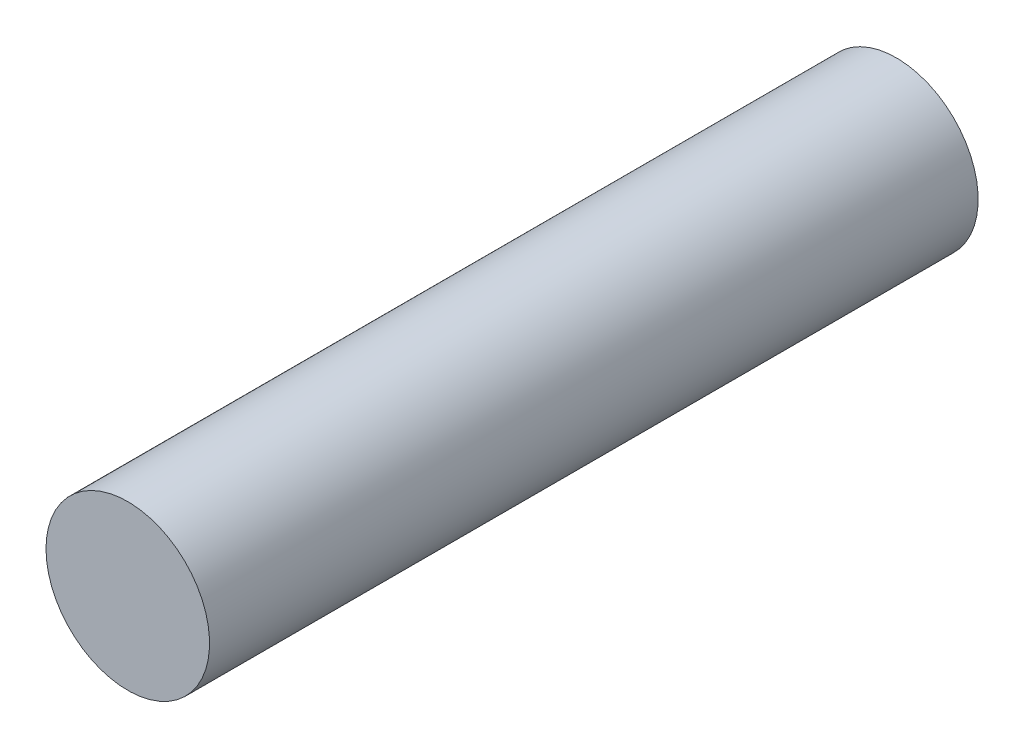
ISO-10303-21;
HEADER;
FILE_DESCRIPTION(('STEP AP214'),'2;1');
FILE_NAME('part.step','',(''),(''),'','','');
FILE_SCHEMA(('AUTOMOTIVE_DESIGN { 1 0 10303 214 1 1 1 1 }'));
ENDSEC;
DATA;
#1=APPLICATION_CONTEXT('core data for automotive mechanical design processes');
#2=APPLICATION_PROTOCOL_DEFINITION('international standard','automotive_design',2000,#1);
#3=PRODUCT_CONTEXT('',#1,'mechanical');
#4=PRODUCT('Part','Part','',(#3));
#5=PRODUCT_RELATED_PRODUCT_CATEGORY('part','',(#4));
#6=PRODUCT_DEFINITION_FORMATION('','',#4);
#7=PRODUCT_DEFINITION_CONTEXT('part definition',#1,'design');
#8=PRODUCT_DEFINITION('design','',#6,#7);
#9=PRODUCT_DEFINITION_SHAPE('','',#8);
#10=(LENGTH_UNIT() NAMED_UNIT(*) SI_UNIT(.MILLI.,.METRE.));
#11=(NAMED_UNIT(*) PLANE_ANGLE_UNIT() SI_UNIT($,.RADIAN.));
#12=(NAMED_UNIT(*) SI_UNIT($,.STERADIAN.) SOLID_ANGLE_UNIT());
#13=UNCERTAINTY_MEASURE_WITH_UNIT(LENGTH_MEASURE(1.E-05),#10,'distance_accuracy_value','');
#14=(GEOMETRIC_REPRESENTATION_CONTEXT(3) GLOBAL_UNCERTAINTY_ASSIGNED_CONTEXT((#13)) GLOBAL_UNIT_ASSIGNED_CONTEXT((#10,
#11,#12)) REPRESENTATION_CONTEXT('',''));
#15=CARTESIAN_POINT('',(0.,0.,0.));
#16=DIRECTION('',(0.,0.,1.));
#17=DIRECTION('',(1.,0.,0.));
#18=AXIS2_PLACEMENT_3D('',#15,#16,#17);
#19=CARTESIAN_POINT('',(0.,0.,29.845));
#20=DIRECTION('',(0.,0.,-1.));
#21=DIRECTION('',(-1.,0.,0.));
#22=AXIS2_PLACEMENT_3D('',#19,#20,#21);
#23=CYLINDRICAL_SURFACE('',#22,3.175);
#24=CARTESIAN_POINT('',(0.,0.,29.845));
#25=DIRECTION('',(0.,0.,1.));
#26=DIRECTION('',(1.,0.,0.));
#27=AXIS2_PLACEMENT_3D('',#24,#25,#26);
#28=CIRCLE('',#27,3.175);
#29=CARTESIAN_POINT('',(-3.175,0.,29.845));
#30=VERTEX_POINT('',#29);
#31=EDGE_CURVE('E10',#30,#30,#28,.T.);
#32=CARTESIAN_POINT('',(0.,0.,0.));
#33=DIRECTION('',(0.,0.,1.));
#34=DIRECTION('',(1.,0.,0.));
#35=AXIS2_PLACEMENT_3D('',#32,#33,#34);
#36=CIRCLE('',#35,3.175);
#37=CARTESIAN_POINT('',(-3.175,0.,0.));
#38=VERTEX_POINT('',#37);
#39=EDGE_CURVE('E35',#38,#38,#36,.T.);
#40=CARTESIAN_POINT('',(-3.175,0.,29.845));
#41=CARTESIAN_POINT('',(-3.175,0.,29.5341145833333));
#42=CARTESIAN_POINT('',(-3.175,0.,29.2232291666667));
#43=CARTESIAN_POINT('',(-3.175,0.,28.6014583333333));
#44=CARTESIAN_POINT('',(-3.175,0.,28.2905729166667));
#45=CARTESIAN_POINT('',(-3.175,0.,27.6688020833333));
#46=CARTESIAN_POINT('',(-3.175,0.,27.3579166666667));
#47=CARTESIAN_POINT('',(-3.175,0.,26.7361458333333));
#48=CARTESIAN_POINT('',(-3.175,0.,26.4252604166667));
#49=CARTESIAN_POINT('',(-3.175,0.,25.8034895833333));
#50=CARTESIAN_POINT('',(-3.175,0.,25.4926041666667));
#51=CARTESIAN_POINT('',(-3.175,0.,24.8708333333333));
#52=CARTESIAN_POINT('',(-3.175,0.,24.5599479166667));
#53=CARTESIAN_POINT('',(-3.175,0.,23.9381770833333));
#54=CARTESIAN_POINT('',(-3.175,0.,23.6272916666667));
#55=CARTESIAN_POINT('',(-3.175,0.,23.0055208333333));
#56=CARTESIAN_POINT('',(-3.175,0.,22.6946354166667));
#57=CARTESIAN_POINT('',(-3.175,0.,22.0728645833333));
#58=CARTESIAN_POINT('',(-3.175,0.,21.7619791666667));
#59=CARTESIAN_POINT('',(-3.175,0.,21.1402083333333));
#60=CARTESIAN_POINT('',(-3.175,0.,20.8293229166667));
#61=CARTESIAN_POINT('',(-3.175,0.,20.2075520833333));
#62=CARTESIAN_POINT('',(-3.175,0.,19.8966666666667));
#63=CARTESIAN_POINT('',(-3.175,0.,19.2748958333333));
#64=CARTESIAN_POINT('',(-3.175,0.,18.9640104166667));
#65=CARTESIAN_POINT('',(-3.175,0.,18.3422395833333));
#66=CARTESIAN_POINT('',(-3.175,0.,18.0313541666667));
#67=CARTESIAN_POINT('',(-3.175,0.,17.4095833333333));
#68=CARTESIAN_POINT('',(-3.175,0.,17.0986979166667));
#69=CARTESIAN_POINT('',(-3.175,0.,16.4769270833333));
#70=CARTESIAN_POINT('',(-3.175,0.,16.1660416666667));
#71=CARTESIAN_POINT('',(-3.175,0.,15.5442708333333));
#72=CARTESIAN_POINT('',(-3.175,0.,15.2333854166667));
#73=CARTESIAN_POINT('',(-3.175,0.,14.6116145833333));
#74=CARTESIAN_POINT('',(-3.175,0.,14.3007291666667));
#75=CARTESIAN_POINT('',(-3.175,0.,13.6789583333333));
#76=CARTESIAN_POINT('',(-3.175,0.,13.3680729166667));
#77=CARTESIAN_POINT('',(-3.175,0.,12.7463020833333));
#78=CARTESIAN_POINT('',(-3.175,0.,12.4354166666667));
#79=CARTESIAN_POINT('',(-3.175,0.,11.8136458333333));
#80=CARTESIAN_POINT('',(-3.175,0.,11.5027604166667));
#81=CARTESIAN_POINT('',(-3.175,0.,10.8809895833333));
#82=CARTESIAN_POINT('',(-3.175,0.,10.5701041666667));
#83=CARTESIAN_POINT('',(-3.175,0.,9.94833333333333));
#84=CARTESIAN_POINT('',(-3.175,0.,9.63744791666667));
#85=CARTESIAN_POINT('',(-3.175,0.,9.01567708333333));
#86=CARTESIAN_POINT('',(-3.175,0.,8.70479166666667));
#87=CARTESIAN_POINT('',(-3.175,0.,8.08302083333333));
#88=CARTESIAN_POINT('',(-3.175,0.,7.77213541666667));
#89=CARTESIAN_POINT('',(-3.175,0.,7.15036458333334));
#90=CARTESIAN_POINT('',(-3.175,0.,6.83947916666667));
#91=CARTESIAN_POINT('',(-3.175,0.,6.21770833333334));
#92=CARTESIAN_POINT('',(-3.175,0.,5.90682291666667));
#93=CARTESIAN_POINT('',(-3.175,0.,5.28505208333334));
#94=CARTESIAN_POINT('',(-3.175,0.,4.97416666666667));
#95=CARTESIAN_POINT('',(-3.175,0.,4.35239583333334));
#96=CARTESIAN_POINT('',(-3.175,0.,4.04151041666667));
#97=CARTESIAN_POINT('',(-3.175,0.,3.41973958333333));
#98=CARTESIAN_POINT('',(-3.175,0.,3.10885416666667));
#99=CARTESIAN_POINT('',(-3.175,0.,2.48708333333333));
#100=CARTESIAN_POINT('',(-3.175,0.,2.17619791666667));
#101=CARTESIAN_POINT('',(-3.175,0.,1.55442708333333));
#102=CARTESIAN_POINT('',(-3.175,0.,1.24354166666667));
#103=CARTESIAN_POINT('',(-3.175,0.,0.621770833333333));
#104=CARTESIAN_POINT('',(-3.175,0.,0.310885416666666));
#105=CARTESIAN_POINT('',(-3.175,0.,0.));
#106=B_SPLINE_CURVE_WITH_KNOTS('',3,(#40,#41,#42,#43,#44,#45,#46,#47,#48,#49,#50,#51,#52,#53,
#54,#55,#56,#57,#58,#59,#60,#61,#62,#63,#64,#65,#66,#67,#68,#69,#70,#71,#72,#73,#74,#75,#76,#77,
#78,#79,#80,#81,#82,#83,#84,#85,#86,#87,#88,#89,#90,#91,#92,#93,#94,#95,#96,#97,#98,#99,#100,
#101,#102,#103,#104,#105),.UNSPECIFIED.,.F.,.F.,(4,2,2,2,2,2,2,2,2,2,2,2,2,2,2,2,2,2,2,2,2,2,2,
2,2,2,2,2,2,2,2,2,4),(0.,0.93265625,1.8653125,2.79796875,3.730625,4.66328125,5.5959375,
6.52859375,7.46125,8.39390625,9.3265625,10.25921875,11.191875,12.12453125,13.0571875,
13.98984375,14.9225,15.85515625,16.7878125,17.72046875,18.653125,19.58578125,20.5184375,
21.45109375,22.38375,23.31640625,24.2490625,25.18171875,26.114375,27.04703125,27.9796875,
28.91234375,29.845),.UNSPECIFIED.);
#107=EDGE_CURVE('BSEAM32',#30,#38,#106,.T.);
#108=ORIENTED_EDGE('',*,*,#31,.F.);
#109=ORIENTED_EDGE('',*,*,#39,.T.);
#110=ORIENTED_EDGE('',*,*,#107,.T.);
#111=ORIENTED_EDGE('',*,*,#107,.F.);
#112=EDGE_LOOP('',(#108,#110,#109,#111));
#113=FACE_BOUND('',#112,.T.);
#114=ADVANCED_FACE('F32',(#113),#23,.T.);
#115=CARTESIAN_POINT('',(0.,0.,29.845));
#116=DIRECTION('',(0.,0.,1.));
#117=DIRECTION('',(1.,0.,0.));
#118=AXIS2_PLACEMENT_3D('',#115,#116,#117);
#119=PLANE('',#118);
#120=ORIENTED_EDGE('',*,*,#31,.T.);
#121=EDGE_LOOP('',(#120));
#122=FACE_BOUND('',#121,.T.);
#123=ADVANCED_FACE('F47',(#122),#119,.T.);
#124=CARTESIAN_POINT('',(0.,0.,0.));
#125=DIRECTION('',(0.,0.,1.));
#126=DIRECTION('',(1.,0.,0.));
#127=AXIS2_PLACEMENT_3D('',#124,#125,#126);
#128=PLANE('',#127);
#129=ORIENTED_EDGE('',*,*,#39,.F.);
#130=EDGE_LOOP('',(#129));
#131=FACE_BOUND('',#130,.T.);
#132=ADVANCED_FACE('F45',(#131),#128,.F.);
#133=CLOSED_SHELL('',(#114,#123,#132));
#134=MANIFOLD_SOLID_BREP('B2',#133);
#135=ADVANCED_BREP_SHAPE_REPRESENTATION('',(#18,#134),#14);
#136=SHAPE_DEFINITION_REPRESENTATION(#9,#135);
ENDSEC;
END-ISO-10303-21;
